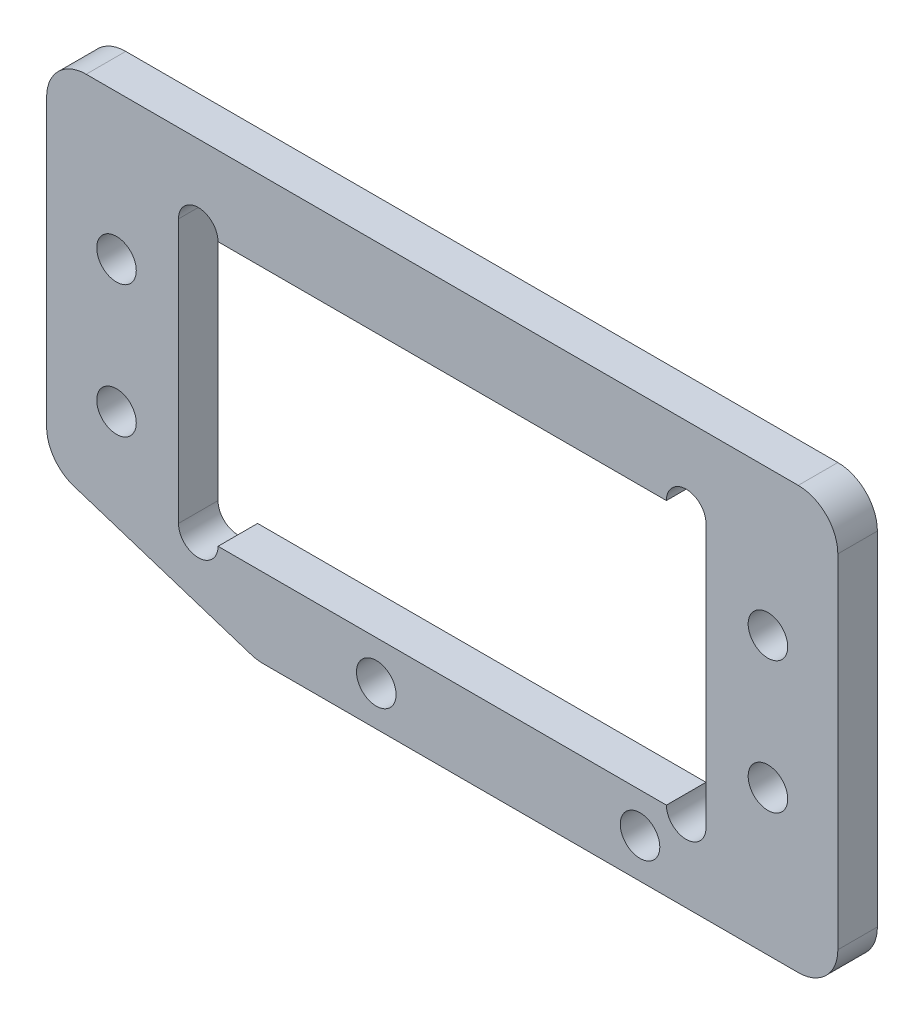
ISO-10303-21;
HEADER;
FILE_DESCRIPTION(('STEP AP214'),'2;1');
FILE_NAME('part.step','',(''),(''),'','','');
FILE_SCHEMA(('AUTOMOTIVE_DESIGN { 1 0 10303 214 1 1 1 1 }'));
ENDSEC;
DATA;
#1=APPLICATION_CONTEXT('core data for automotive mechanical design processes');
#2=APPLICATION_PROTOCOL_DEFINITION('international standard','automotive_design',2000,#1);
#3=PRODUCT_CONTEXT('',#1,'mechanical');
#4=PRODUCT('Part','Part','',(#3));
#5=PRODUCT_RELATED_PRODUCT_CATEGORY('part','',(#4));
#6=PRODUCT_DEFINITION_FORMATION('','',#4);
#7=PRODUCT_DEFINITION_CONTEXT('part definition',#1,'design');
#8=PRODUCT_DEFINITION('design','',#6,#7);
#9=PRODUCT_DEFINITION_SHAPE('','',#8);
#10=(LENGTH_UNIT() NAMED_UNIT(*) SI_UNIT(.MILLI.,.METRE.));
#11=(NAMED_UNIT(*) PLANE_ANGLE_UNIT() SI_UNIT($,.RADIAN.));
#12=(NAMED_UNIT(*) SI_UNIT($,.STERADIAN.) SOLID_ANGLE_UNIT());
#13=UNCERTAINTY_MEASURE_WITH_UNIT(LENGTH_MEASURE(1.E-05),#10,'distance_accuracy_value','');
#14=(GEOMETRIC_REPRESENTATION_CONTEXT(3) GLOBAL_UNCERTAINTY_ASSIGNED_CONTEXT((#13)) GLOBAL_UNIT_ASSIGNED_CONTEXT((#10,
#11,#12)) REPRESENTATION_CONTEXT('',''));
#15=CARTESIAN_POINT('',(0.,0.,0.));
#16=DIRECTION('',(0.,0.,1.));
#17=DIRECTION('',(1.,0.,0.));
#18=AXIS2_PLACEMENT_3D('',#15,#16,#17);
#19=CARTESIAN_POINT('',(0.,0.,3.));
#20=DIRECTION('',(0.,0.,1.));
#21=DIRECTION('',(1.,0.,0.));
#22=AXIS2_PLACEMENT_3D('',#19,#20,#21);
#23=PLANE('',#22);
#24=DIRECTION('',(0.,-1.,0.));
#25=VECTOR('',#24,1.);
#26=CARTESIAN_POINT('',(-10.,6.,3.));
#27=LINE('',#26,#25);
#28=CARTESIAN_POINT('',(-10.,3.,3.));
#29=VERTEX_POINT('',#28);
#30=CARTESIAN_POINT('',(-10.,-18.6692396681873,3.));
#31=VERTEX_POINT('',#30);
#32=EDGE_CURVE('E218',#29,#31,#27,.T.);
#33=ORIENTED_EDGE('',*,*,#32,.T.);
#34=CARTESIAN_POINT('',(-7.,-18.6692396681873,3.));
#35=DIRECTION('',(0.,0.,1.));
#36=DIRECTION('',(1.,0.,0.));
#37=AXIS2_PLACEMENT_3D('',#34,#35,#36);
#38=CIRCLE('',#37,3.);
#39=CARTESIAN_POINT('',(-7.9214460683982,-21.5242242816368,3.));
#40=VERTEX_POINT('',#39);
#41=EDGE_CURVE('E42',#31,#40,#38,.T.);
#42=ORIENTED_EDGE('',*,*,#41,.T.);
#43=DIRECTION('',(-0.951661537816506,0.307148689466068,0.));
#44=VECTOR('',#43,1.);
#45=CARTESIAN_POINT('',(-7.03887680716743,-21.8090734440523,3.));
#46=LINE('',#45,#44);
#47=CARTESIAN_POINT('',(5.4968694857136,-25.8549846134495,3.));
#48=VERTEX_POINT('',#47);
#49=EDGE_CURVE('E280',#48,#40,#46,.T.);
#50=ORIENTED_EDGE('',*,*,#49,.F.);
#51=CARTESIAN_POINT('',(6.4183155541118,-23.,3.));
#52=DIRECTION('',(0.,0.,1.));
#53=DIRECTION('',(1.,0.,0.));
#54=AXIS2_PLACEMENT_3D('',#51,#52,#53);
#55=CIRCLE('',#54,3.);
#56=CARTESIAN_POINT('',(6.4183155541118,-26.,3.));
#57=VERTEX_POINT('',#56);
#58=EDGE_CURVE('E49',#48,#57,#55,.T.);
#59=ORIENTED_EDGE('',*,*,#58,.T.);
#60=DIRECTION('',(1.,0.,0.));
#61=VECTOR('',#60,1.);
#62=CARTESIAN_POINT('',(-10.,-26.,3.));
#63=LINE('',#62,#61);
#64=CARTESIAN_POINT('',(47.,-26.,3.));
#65=VERTEX_POINT('',#64);
#66=EDGE_CURVE('E220',#57,#65,#63,.T.);
#67=ORIENTED_EDGE('',*,*,#66,.T.);
#68=CARTESIAN_POINT('',(47.,-23.,3.));
#69=DIRECTION('',(0.,0.,1.));
#70=DIRECTION('',(1.,0.,0.));
#71=AXIS2_PLACEMENT_3D('',#68,#69,#70);
#72=CIRCLE('',#71,3.);
#73=CARTESIAN_POINT('',(50.,-23.,3.));
#74=VERTEX_POINT('',#73);
#75=EDGE_CURVE('E258',#65,#74,#72,.T.);
#76=ORIENTED_EDGE('',*,*,#75,.T.);
#77=DIRECTION('',(0.,1.,0.));
#78=VECTOR('',#77,1.);
#79=CARTESIAN_POINT('',(50.,6.,3.));
#80=LINE('',#79,#78);
#81=CARTESIAN_POINT('',(50.,3.,3.));
#82=VERTEX_POINT('',#81);
#83=EDGE_CURVE('E223',#74,#82,#80,.T.);
#84=ORIENTED_EDGE('',*,*,#83,.T.);
#85=CARTESIAN_POINT('',(47.,3.,3.));
#86=DIRECTION('',(0.,0.,1.));
#87=DIRECTION('',(1.,0.,0.));
#88=AXIS2_PLACEMENT_3D('',#85,#86,#87);
#89=CIRCLE('',#88,3.);
#90=CARTESIAN_POINT('',(47.,6.,3.));
#91=VERTEX_POINT('',#90);
#92=EDGE_CURVE('E260',#82,#91,#89,.T.);
#93=ORIENTED_EDGE('',*,*,#92,.T.);
#94=DIRECTION('',(-1.,0.,0.));
#95=VECTOR('',#94,1.);
#96=CARTESIAN_POINT('',(-10.,6.,3.));
#97=LINE('',#96,#95);
#98=CARTESIAN_POINT('',(-7.,6.,3.));
#99=VERTEX_POINT('',#98);
#100=EDGE_CURVE('E173',#91,#99,#97,.T.);
#101=ORIENTED_EDGE('',*,*,#100,.T.);
#102=CARTESIAN_POINT('',(-7.,3.,3.));
#103=DIRECTION('',(0.,0.,1.));
#104=DIRECTION('',(1.,0.,0.));
#105=AXIS2_PLACEMENT_3D('',#102,#103,#104);
#106=CIRCLE('',#105,3.);
#107=EDGE_CURVE('E256',#99,#29,#106,.T.);
#108=ORIENTED_EDGE('',*,*,#107,.T.);
#109=EDGE_LOOP('',(#33,#42,#50,#59,#67,#76,#84,#93,#101,#108));
#110=FACE_BOUND('',#109,.T.);
#111=CARTESIAN_POINT('',(1.5,-20.,3.));
#112=DIRECTION('',(0.,0.,1.));
#113=DIRECTION('',(1.,0.,0.));
#114=AXIS2_PLACEMENT_3D('',#111,#112,#113);
#115=CIRCLE('',#114,1.5);
#116=CARTESIAN_POINT('',(0.,-20.,3.));
#117=VERTEX_POINT('',#116);
#118=CARTESIAN_POINT('',(3.,-20.,3.));
#119=VERTEX_POINT('',#118);
#120=EDGE_CURVE('E288',#117,#119,#115,.T.);
#121=ORIENTED_EDGE('',*,*,#120,.F.);
#122=DIRECTION('',(0.,-1.,0.));
#123=VECTOR('',#122,1.);
#124=CARTESIAN_POINT('',(0.,0.,3.));
#125=LINE('',#124,#123);
#126=CARTESIAN_POINT('',(0.,0.,3.));
#127=VERTEX_POINT('',#126);
#128=EDGE_CURVE('E183',#127,#117,#125,.T.);
#129=ORIENTED_EDGE('',*,*,#128,.F.);
#130=CARTESIAN_POINT('',(1.5,0.,3.));
#131=DIRECTION('',(0.,0.,1.));
#132=DIRECTION('',(1.,0.,0.));
#133=AXIS2_PLACEMENT_3D('',#130,#131,#132);
#134=CIRCLE('',#133,1.5);
#135=CARTESIAN_POINT('',(3.,0.,3.));
#136=VERTEX_POINT('',#135);
#137=EDGE_CURVE('E164',#136,#127,#134,.T.);
#138=ORIENTED_EDGE('',*,*,#137,.F.);
#139=DIRECTION('',(-1.,0.,0.));
#140=VECTOR('',#139,1.);
#141=CARTESIAN_POINT('',(0.,0.,3.));
#142=LINE('',#141,#140);
#143=CARTESIAN_POINT('',(37.,0.,3.));
#144=VERTEX_POINT('',#143);
#145=EDGE_CURVE('E181',#144,#136,#142,.T.);
#146=ORIENTED_EDGE('',*,*,#145,.F.);
#147=CARTESIAN_POINT('',(38.5,0.,3.));
#148=DIRECTION('',(0.,0.,1.));
#149=DIRECTION('',(1.,0.,0.));
#150=AXIS2_PLACEMENT_3D('',#147,#148,#149);
#151=CIRCLE('',#150,1.5);
#152=CARTESIAN_POINT('',(40.,0.,3.));
#153=VERTEX_POINT('',#152);
#154=EDGE_CURVE('E465',#153,#144,#151,.T.);
#155=ORIENTED_EDGE('',*,*,#154,.F.);
#156=DIRECTION('',(0.,1.,0.));
#157=VECTOR('',#156,1.);
#158=CARTESIAN_POINT('',(40.,0.,3.));
#159=LINE('',#158,#157);
#160=CARTESIAN_POINT('',(40.,-20.,3.));
#161=VERTEX_POINT('',#160);
#162=EDGE_CURVE('E189',#161,#153,#159,.T.);
#163=ORIENTED_EDGE('',*,*,#162,.F.);
#164=CARTESIAN_POINT('',(38.5,-20.,3.));
#165=DIRECTION('',(0.,0.,1.));
#166=DIRECTION('',(1.,0.,0.));
#167=AXIS2_PLACEMENT_3D('',#164,#165,#166);
#168=CIRCLE('',#167,1.5);
#169=CARTESIAN_POINT('',(37.,-20.,3.));
#170=VERTEX_POINT('',#169);
#171=EDGE_CURVE('E417',#170,#161,#168,.T.);
#172=ORIENTED_EDGE('',*,*,#171,.F.);
#173=DIRECTION('',(1.,0.,0.));
#174=VECTOR('',#173,1.);
#175=CARTESIAN_POINT('',(0.,-20.,3.));
#176=LINE('',#175,#174);
#177=EDGE_CURVE('E194',#119,#170,#176,.T.);
#178=ORIENTED_EDGE('',*,*,#177,.F.);
#179=EDGE_LOOP('',(#121,#129,#138,#146,#155,#163,#172,#178));
#180=FACE_BOUND('',#179,.T.);
#181=CARTESIAN_POINT('',(35.,-23.,3.));
#182=DIRECTION('',(0.,0.,1.));
#183=DIRECTION('',(1.,0.,0.));
#184=AXIS2_PLACEMENT_3D('',#181,#182,#183);
#185=CIRCLE('',#184,1.5);
#186=CARTESIAN_POINT('',(36.5,-23.,3.));
#187=VERTEX_POINT('',#186);
#188=EDGE_CURVE('E441',#187,#187,#185,.T.);
#189=ORIENTED_EDGE('',*,*,#188,.F.);
#190=EDGE_LOOP('',(#189));
#191=FACE_BOUND('',#190,.T.);
#192=CARTESIAN_POINT('',(44.7,-5.,3.));
#193=DIRECTION('',(0.,0.,1.));
#194=DIRECTION('',(1.,0.,0.));
#195=AXIS2_PLACEMENT_3D('',#192,#193,#194);
#196=CIRCLE('',#195,1.5);
#197=CARTESIAN_POINT('',(46.2,-5.,3.));
#198=VERTEX_POINT('',#197);
#199=EDGE_CURVE('E429',#198,#198,#196,.T.);
#200=ORIENTED_EDGE('',*,*,#199,.F.);
#201=EDGE_LOOP('',(#200));
#202=FACE_BOUND('',#201,.T.);
#203=CARTESIAN_POINT('',(-4.7,-5.,3.));
#204=DIRECTION('',(0.,0.,1.));
#205=DIRECTION('',(1.,0.,0.));
#206=AXIS2_PLACEMENT_3D('',#203,#204,#205);
#207=CIRCLE('',#206,1.5);
#208=CARTESIAN_POINT('',(-3.2,-5.,3.));
#209=VERTEX_POINT('',#208);
#210=EDGE_CURVE('E202',#209,#209,#207,.T.);
#211=ORIENTED_EDGE('',*,*,#210,.F.);
#212=EDGE_LOOP('',(#211));
#213=FACE_BOUND('',#212,.T.);
#214=CARTESIAN_POINT('',(-4.7,-15.,3.));
#215=DIRECTION('',(0.,0.,1.));
#216=DIRECTION('',(1.,0.,0.));
#217=AXIS2_PLACEMENT_3D('',#214,#215,#216);
#218=CIRCLE('',#217,1.5);
#219=CARTESIAN_POINT('',(-3.2,-15.,3.));
#220=VERTEX_POINT('',#219);
#221=EDGE_CURVE('E423',#220,#220,#218,.T.);
#222=ORIENTED_EDGE('',*,*,#221,.F.);
#223=EDGE_LOOP('',(#222));
#224=FACE_BOUND('',#223,.T.);
#225=CARTESIAN_POINT('',(44.7,-15.,3.));
#226=DIRECTION('',(0.,0.,1.));
#227=DIRECTION('',(1.,0.,0.));
#228=AXIS2_PLACEMENT_3D('',#225,#226,#227);
#229=CIRCLE('',#228,1.5);
#230=CARTESIAN_POINT('',(46.2,-15.,3.));
#231=VERTEX_POINT('',#230);
#232=EDGE_CURVE('E435',#231,#231,#229,.T.);
#233=ORIENTED_EDGE('',*,*,#232,.F.);
#234=EDGE_LOOP('',(#233));
#235=FACE_BOUND('',#234,.T.);
#236=CARTESIAN_POINT('',(15.,-23.,3.));
#237=DIRECTION('',(0.,0.,1.));
#238=DIRECTION('',(1.,0.,0.));
#239=AXIS2_PLACEMENT_3D('',#236,#237,#238);
#240=CIRCLE('',#239,1.5);
#241=CARTESIAN_POINT('',(16.5,-23.,3.));
#242=VERTEX_POINT('',#241);
#243=EDGE_CURVE('E447',#242,#242,#240,.T.);
#244=ORIENTED_EDGE('',*,*,#243,.F.);
#245=EDGE_LOOP('',(#244));
#246=FACE_BOUND('',#245,.T.);
#247=ADVANCED_FACE('F34',(#110,#180,#191,#202,#213,#224,#235,#246),#23,.T.);
#248=CARTESIAN_POINT('',(0.,0.,0.));
#249=DIRECTION('',(0.,0.,1.));
#250=DIRECTION('',(1.,0.,0.));
#251=AXIS2_PLACEMENT_3D('',#248,#249,#250);
#252=PLANE('',#251);
#253=DIRECTION('',(0.951661537816506,-0.307148689466068,0.));
#254=VECTOR('',#253,1.);
#255=CARTESIAN_POINT('',(5.94618140044645,-26.,0.));
#256=LINE('',#255,#254);
#257=CARTESIAN_POINT('',(-7.9214460683982,-21.5242242816368,0.));
#258=VERTEX_POINT('',#257);
#259=CARTESIAN_POINT('',(5.4968694857136,-25.8549846134495,0.));
#260=VERTEX_POINT('',#259);
#261=EDGE_CURVE('E289',#258,#260,#256,.T.);
#262=ORIENTED_EDGE('',*,*,#261,.F.);
#263=CARTESIAN_POINT('',(-7.,-18.6692396681873,0.));
#264=DIRECTION('',(0.,0.,1.));
#265=DIRECTION('',(1.,0.,0.));
#266=AXIS2_PLACEMENT_3D('',#263,#264,#265);
#267=CIRCLE('',#266,3.);
#268=CARTESIAN_POINT('',(-10.,-18.6692396681873,0.));
#269=VERTEX_POINT('',#268);
#270=EDGE_CURVE('E275',#258,#269,#267,.F.);
#271=ORIENTED_EDGE('',*,*,#270,.T.);
#272=DIRECTION('',(0.,-1.,0.));
#273=VECTOR('',#272,1.);
#274=CARTESIAN_POINT('',(-10.,6.,0.));
#275=LINE('',#274,#273);
#276=CARTESIAN_POINT('',(-10.,3.,0.));
#277=VERTEX_POINT('',#276);
#278=EDGE_CURVE('E217',#277,#269,#275,.T.);
#279=ORIENTED_EDGE('',*,*,#278,.F.);
#280=CARTESIAN_POINT('',(-7.,3.,0.));
#281=DIRECTION('',(0.,0.,1.));
#282=DIRECTION('',(1.,0.,0.));
#283=AXIS2_PLACEMENT_3D('',#280,#281,#282);
#284=CIRCLE('',#283,3.);
#285=CARTESIAN_POINT('',(-7.,6.,0.));
#286=VERTEX_POINT('',#285);
#287=EDGE_CURVE('E244',#277,#286,#284,.F.);
#288=ORIENTED_EDGE('',*,*,#287,.T.);
#289=DIRECTION('',(-1.,0.,0.));
#290=VECTOR('',#289,1.);
#291=CARTESIAN_POINT('',(-10.,6.,0.));
#292=LINE('',#291,#290);
#293=CARTESIAN_POINT('',(47.,6.,0.));
#294=VERTEX_POINT('',#293);
#295=EDGE_CURVE('E221',#294,#286,#292,.T.);
#296=ORIENTED_EDGE('',*,*,#295,.F.);
#297=CARTESIAN_POINT('',(47.,3.,0.));
#298=DIRECTION('',(0.,0.,1.));
#299=DIRECTION('',(1.,0.,0.));
#300=AXIS2_PLACEMENT_3D('',#297,#298,#299);
#301=CIRCLE('',#300,3.);
#302=CARTESIAN_POINT('',(50.,3.,0.));
#303=VERTEX_POINT('',#302);
#304=EDGE_CURVE('E249',#294,#303,#301,.F.);
#305=ORIENTED_EDGE('',*,*,#304,.T.);
#306=DIRECTION('',(0.,1.,0.));
#307=VECTOR('',#306,1.);
#308=CARTESIAN_POINT('',(50.,6.,0.));
#309=LINE('',#308,#307);
#310=CARTESIAN_POINT('',(50.,-23.,0.));
#311=VERTEX_POINT('',#310);
#312=EDGE_CURVE('E231',#311,#303,#309,.T.);
#313=ORIENTED_EDGE('',*,*,#312,.F.);
#314=CARTESIAN_POINT('',(47.,-23.,0.));
#315=DIRECTION('',(0.,0.,1.));
#316=DIRECTION('',(1.,0.,0.));
#317=AXIS2_PLACEMENT_3D('',#314,#315,#316);
#318=CIRCLE('',#317,3.);
#319=CARTESIAN_POINT('',(47.,-26.,0.));
#320=VERTEX_POINT('',#319);
#321=EDGE_CURVE('E246',#311,#320,#318,.F.);
#322=ORIENTED_EDGE('',*,*,#321,.T.);
#323=DIRECTION('',(1.,0.,0.));
#324=VECTOR('',#323,1.);
#325=CARTESIAN_POINT('',(-10.,-26.,0.));
#326=LINE('',#325,#324);
#327=CARTESIAN_POINT('',(6.4183155541118,-26.,0.));
#328=VERTEX_POINT('',#327);
#329=EDGE_CURVE('E229',#328,#320,#326,.T.);
#330=ORIENTED_EDGE('',*,*,#329,.F.);
#331=CARTESIAN_POINT('',(6.4183155541118,-23.,0.));
#332=DIRECTION('',(0.,0.,1.));
#333=DIRECTION('',(1.,0.,0.));
#334=AXIS2_PLACEMENT_3D('',#331,#332,#333);
#335=CIRCLE('',#334,3.);
#336=EDGE_CURVE('E273',#328,#260,#335,.F.);
#337=ORIENTED_EDGE('',*,*,#336,.T.);
#338=EDGE_LOOP('',(#262,#271,#279,#288,#296,#305,#313,#322,#330,#337));
#339=FACE_BOUND('',#338,.T.);
#340=DIRECTION('',(0.,-1.,0.));
#341=VECTOR('',#340,1.);
#342=CARTESIAN_POINT('',(0.,0.,0.));
#343=LINE('',#342,#341);
#344=CARTESIAN_POINT('',(0.,0.,0.));
#345=VERTEX_POINT('',#344);
#346=CARTESIAN_POINT('',(0.,-20.,0.));
#347=VERTEX_POINT('',#346);
#348=EDGE_CURVE('E198',#345,#347,#343,.T.);
#349=ORIENTED_EDGE('',*,*,#348,.T.);
#350=CARTESIAN_POINT('',(1.5,-20.,0.));
#351=DIRECTION('',(0.,0.,1.));
#352=DIRECTION('',(1.,0.,0.));
#353=AXIS2_PLACEMENT_3D('',#350,#351,#352);
#354=CIRCLE('',#353,1.5);
#355=CARTESIAN_POINT('',(3.,-20.,0.));
#356=VERTEX_POINT('',#355);
#357=EDGE_CURVE('E459',#347,#356,#354,.T.);
#358=ORIENTED_EDGE('',*,*,#357,.T.);
#359=DIRECTION('',(1.,0.,0.));
#360=VECTOR('',#359,1.);
#361=CARTESIAN_POINT('',(0.,-20.,0.));
#362=LINE('',#361,#360);
#363=CARTESIAN_POINT('',(37.,-20.,0.));
#364=VERTEX_POINT('',#363);
#365=EDGE_CURVE('E201',#356,#364,#362,.T.);
#366=ORIENTED_EDGE('',*,*,#365,.T.);
#367=CARTESIAN_POINT('',(38.5,-20.,0.));
#368=DIRECTION('',(0.,0.,1.));
#369=DIRECTION('',(1.,0.,0.));
#370=AXIS2_PLACEMENT_3D('',#367,#368,#369);
#371=CIRCLE('',#370,1.5);
#372=CARTESIAN_POINT('',(40.,-20.,0.));
#373=VERTEX_POINT('',#372);
#374=EDGE_CURVE('E462',#364,#373,#371,.T.);
#375=ORIENTED_EDGE('',*,*,#374,.T.);
#376=DIRECTION('',(0.,1.,0.));
#377=VECTOR('',#376,1.);
#378=CARTESIAN_POINT('',(40.,0.,0.));
#379=LINE('',#378,#377);
#380=CARTESIAN_POINT('',(40.,0.,0.));
#381=VERTEX_POINT('',#380);
#382=EDGE_CURVE('E205',#373,#381,#379,.T.);
#383=ORIENTED_EDGE('',*,*,#382,.T.);
#384=CARTESIAN_POINT('',(38.5,0.,0.));
#385=DIRECTION('',(0.,0.,1.));
#386=DIRECTION('',(1.,0.,0.));
#387=AXIS2_PLACEMENT_3D('',#384,#385,#386);
#388=CIRCLE('',#387,1.5);
#389=CARTESIAN_POINT('',(37.,0.,0.));
#390=VERTEX_POINT('',#389);
#391=EDGE_CURVE('E184',#381,#390,#388,.T.);
#392=ORIENTED_EDGE('',*,*,#391,.T.);
#393=DIRECTION('',(-1.,0.,0.));
#394=VECTOR('',#393,1.);
#395=CARTESIAN_POINT('',(0.,0.,0.));
#396=LINE('',#395,#394);
#397=CARTESIAN_POINT('',(3.,0.,0.));
#398=VERTEX_POINT('',#397);
#399=EDGE_CURVE('E208',#390,#398,#396,.T.);
#400=ORIENTED_EDGE('',*,*,#399,.T.);
#401=CARTESIAN_POINT('',(1.5,0.,0.));
#402=DIRECTION('',(0.,0.,1.));
#403=DIRECTION('',(1.,0.,0.));
#404=AXIS2_PLACEMENT_3D('',#401,#402,#403);
#405=CIRCLE('',#404,1.5);
#406=EDGE_CURVE('E167',#398,#345,#405,.T.);
#407=ORIENTED_EDGE('',*,*,#406,.T.);
#408=EDGE_LOOP('',(#349,#358,#366,#375,#383,#392,#400,#407));
#409=FACE_BOUND('',#408,.T.);
#410=CARTESIAN_POINT('',(-4.7,-5.,0.));
#411=DIRECTION('',(0.,0.,1.));
#412=DIRECTION('',(1.,0.,0.));
#413=AXIS2_PLACEMENT_3D('',#410,#411,#412);
#414=CIRCLE('',#413,1.5);
#415=CARTESIAN_POINT('',(-3.2,-5.,0.));
#416=VERTEX_POINT('',#415);
#417=EDGE_CURVE('E420',#416,#416,#414,.T.);
#418=ORIENTED_EDGE('',*,*,#417,.T.);
#419=EDGE_LOOP('',(#418));
#420=FACE_BOUND('',#419,.T.);
#421=CARTESIAN_POINT('',(-4.7,-15.,0.));
#422=DIRECTION('',(0.,0.,1.));
#423=DIRECTION('',(1.,0.,0.));
#424=AXIS2_PLACEMENT_3D('',#421,#422,#423);
#425=CIRCLE('',#424,1.5);
#426=CARTESIAN_POINT('',(-3.2,-15.,0.));
#427=VERTEX_POINT('',#426);
#428=EDGE_CURVE('E426',#427,#427,#425,.T.);
#429=ORIENTED_EDGE('',*,*,#428,.T.);
#430=EDGE_LOOP('',(#429));
#431=FACE_BOUND('',#430,.T.);
#432=CARTESIAN_POINT('',(44.7,-5.,0.));
#433=DIRECTION('',(0.,0.,1.));
#434=DIRECTION('',(1.,0.,0.));
#435=AXIS2_PLACEMENT_3D('',#432,#433,#434);
#436=CIRCLE('',#435,1.5);
#437=CARTESIAN_POINT('',(46.2,-5.,0.));
#438=VERTEX_POINT('',#437);
#439=EDGE_CURVE('E432',#438,#438,#436,.T.);
#440=ORIENTED_EDGE('',*,*,#439,.T.);
#441=EDGE_LOOP('',(#440));
#442=FACE_BOUND('',#441,.T.);
#443=CARTESIAN_POINT('',(44.7,-15.,0.));
#444=DIRECTION('',(0.,0.,1.));
#445=DIRECTION('',(1.,0.,0.));
#446=AXIS2_PLACEMENT_3D('',#443,#444,#445);
#447=CIRCLE('',#446,1.5);
#448=CARTESIAN_POINT('',(46.2,-15.,0.));
#449=VERTEX_POINT('',#448);
#450=EDGE_CURVE('E438',#449,#449,#447,.T.);
#451=ORIENTED_EDGE('',*,*,#450,.T.);
#452=EDGE_LOOP('',(#451));
#453=FACE_BOUND('',#452,.T.);
#454=CARTESIAN_POINT('',(35.,-23.,0.));
#455=DIRECTION('',(0.,0.,1.));
#456=DIRECTION('',(1.,0.,0.));
#457=AXIS2_PLACEMENT_3D('',#454,#455,#456);
#458=CIRCLE('',#457,1.5);
#459=CARTESIAN_POINT('',(36.5,-23.,0.));
#460=VERTEX_POINT('',#459);
#461=EDGE_CURVE('E444',#460,#460,#458,.T.);
#462=ORIENTED_EDGE('',*,*,#461,.T.);
#463=EDGE_LOOP('',(#462));
#464=FACE_BOUND('',#463,.T.);
#465=CARTESIAN_POINT('',(15.,-23.,0.));
#466=DIRECTION('',(0.,0.,1.));
#467=DIRECTION('',(1.,0.,0.));
#468=AXIS2_PLACEMENT_3D('',#465,#466,#467);
#469=CIRCLE('',#468,1.5);
#470=CARTESIAN_POINT('',(16.5,-23.,0.));
#471=VERTEX_POINT('',#470);
#472=EDGE_CURVE('E450',#471,#471,#469,.T.);
#473=ORIENTED_EDGE('',*,*,#472,.T.);
#474=EDGE_LOOP('',(#473));
#475=FACE_BOUND('',#474,.T.);
#476=ADVANCED_FACE('F294',(#339,#409,#420,#431,#442,#453,#464,#475),#252,.F.);
#477=CARTESIAN_POINT('',(-10.,6.,3.));
#478=DIRECTION('',(1.,0.,0.));
#479=DIRECTION('',(0.,1.,0.));
#480=AXIS2_PLACEMENT_3D('',#477,#478,#479);
#481=PLANE('',#480);
#482=ORIENTED_EDGE('',*,*,#278,.T.);
#483=DIRECTION('',(0.,0.,-1.));
#484=VECTOR('',#483,1.);
#485=CARTESIAN_POINT('',(-10.,-18.6692396681873,3.));
#486=LINE('',#485,#484);
#487=EDGE_CURVE('E57',#269,#31,#486,.F.);
#488=ORIENTED_EDGE('',*,*,#487,.T.);
#489=ORIENTED_EDGE('',*,*,#32,.F.);
#490=DIRECTION('',(0.,0.,-1.));
#491=VECTOR('',#490,1.);
#492=CARTESIAN_POINT('',(-10.,3.,3.));
#493=LINE('',#492,#491);
#494=EDGE_CURVE('E265',#29,#277,#493,.T.);
#495=ORIENTED_EDGE('',*,*,#494,.T.);
#496=EDGE_LOOP('',(#482,#488,#489,#495));
#497=FACE_BOUND('',#496,.T.);
#498=ADVANCED_FACE('F296',(#497),#481,.F.);
#499=CARTESIAN_POINT('',(-10.,-26.,3.));
#500=DIRECTION('',(0.,1.,0.));
#501=DIRECTION('',(0.,0.,1.));
#502=AXIS2_PLACEMENT_3D('',#499,#500,#501);
#503=PLANE('',#502);
#504=ORIENTED_EDGE('',*,*,#66,.F.);
#505=DIRECTION('',(0.,0.,-1.));
#506=VECTOR('',#505,1.);
#507=CARTESIAN_POINT('',(6.4183155541118,-26.,3.));
#508=LINE('',#507,#506);
#509=EDGE_CURVE('E11',#57,#328,#508,.T.);
#510=ORIENTED_EDGE('',*,*,#509,.T.);
#511=ORIENTED_EDGE('',*,*,#329,.T.);
#512=DIRECTION('',(0.,0.,-1.));
#513=VECTOR('',#512,1.);
#514=CARTESIAN_POINT('',(47.,-26.,3.));
#515=LINE('',#514,#513);
#516=EDGE_CURVE('E262',#320,#65,#515,.F.);
#517=ORIENTED_EDGE('',*,*,#516,.T.);
#518=EDGE_LOOP('',(#504,#510,#511,#517));
#519=FACE_BOUND('',#518,.T.);
#520=ADVANCED_FACE('F322',(#519),#503,.F.);
#521=CARTESIAN_POINT('',(50.,6.,3.));
#522=DIRECTION('',(-1.,0.,0.));
#523=DIRECTION('',(0.,-1.,0.));
#524=AXIS2_PLACEMENT_3D('',#521,#522,#523);
#525=PLANE('',#524);
#526=ORIENTED_EDGE('',*,*,#312,.T.);
#527=DIRECTION('',(0.,0.,-1.));
#528=VECTOR('',#527,1.);
#529=CARTESIAN_POINT('',(50.,3.,3.));
#530=LINE('',#529,#528);
#531=EDGE_CURVE('E254',#303,#82,#530,.F.);
#532=ORIENTED_EDGE('',*,*,#531,.T.);
#533=ORIENTED_EDGE('',*,*,#83,.F.);
#534=DIRECTION('',(0.,0.,-1.));
#535=VECTOR('',#534,1.);
#536=CARTESIAN_POINT('',(50.,-23.,3.));
#537=LINE('',#536,#535);
#538=EDGE_CURVE('E251',#74,#311,#537,.T.);
#539=ORIENTED_EDGE('',*,*,#538,.T.);
#540=EDGE_LOOP('',(#526,#532,#533,#539));
#541=FACE_BOUND('',#540,.T.);
#542=ADVANCED_FACE('F313',(#541),#525,.F.);
#543=CARTESIAN_POINT('',(-10.,6.,3.));
#544=DIRECTION('',(0.,-1.,0.));
#545=DIRECTION('',(0.,0.,-1.));
#546=AXIS2_PLACEMENT_3D('',#543,#544,#545);
#547=PLANE('',#546);
#548=ORIENTED_EDGE('',*,*,#100,.F.);
#549=DIRECTION('',(0.,0.,-1.));
#550=VECTOR('',#549,1.);
#551=CARTESIAN_POINT('',(47.,6.,3.));
#552=LINE('',#551,#550);
#553=EDGE_CURVE('E241',#91,#294,#552,.T.);
#554=ORIENTED_EDGE('',*,*,#553,.T.);
#555=ORIENTED_EDGE('',*,*,#295,.T.);
#556=DIRECTION('',(0.,0.,-1.));
#557=VECTOR('',#556,1.);
#558=CARTESIAN_POINT('',(-7.,6.,3.));
#559=LINE('',#558,#557);
#560=EDGE_CURVE('E239',#286,#99,#559,.F.);
#561=ORIENTED_EDGE('',*,*,#560,.T.);
#562=EDGE_LOOP('',(#548,#554,#555,#561));
#563=FACE_BOUND('',#562,.T.);
#564=ADVANCED_FACE('F305',(#563),#547,.F.);
#565=CARTESIAN_POINT('',(0.,0.,3.));
#566=DIRECTION('',(1.,0.,0.));
#567=DIRECTION('',(0.,1.,0.));
#568=AXIS2_PLACEMENT_3D('',#565,#566,#567);
#569=PLANE('',#568);
#570=ORIENTED_EDGE('',*,*,#348,.F.);
#571=DIRECTION('',(0.,0.,-1.));
#572=VECTOR('',#571,1.);
#573=CARTESIAN_POINT('',(0.,0.,3.));
#574=LINE('',#573,#572);
#575=EDGE_CURVE('E188',#127,#345,#574,.T.);
#576=ORIENTED_EDGE('',*,*,#575,.F.);
#577=ORIENTED_EDGE('',*,*,#128,.T.);
#578=DIRECTION('',(0.,0.,-1.));
#579=VECTOR('',#578,1.);
#580=CARTESIAN_POINT('',(0.,-20.,3.));
#581=LINE('',#580,#579);
#582=EDGE_CURVE('E214',#117,#347,#581,.T.);
#583=ORIENTED_EDGE('',*,*,#582,.T.);
#584=EDGE_LOOP('',(#570,#576,#577,#583));
#585=FACE_BOUND('',#584,.T.);
#586=ADVANCED_FACE('F336',(#585),#569,.T.);
#587=CARTESIAN_POINT('',(0.,-20.,3.));
#588=DIRECTION('',(0.,1.,0.));
#589=DIRECTION('',(0.,0.,1.));
#590=AXIS2_PLACEMENT_3D('',#587,#588,#589);
#591=PLANE('',#590);
#592=DIRECTION('',(0.,0.,1.));
#593=VECTOR('',#592,1.);
#594=CARTESIAN_POINT('',(3.,-20.,0.));
#595=LINE('',#594,#593);
#596=EDGE_CURVE('E237',#119,#356,#595,.F.);
#597=ORIENTED_EDGE('',*,*,#596,.F.);
#598=ORIENTED_EDGE('',*,*,#177,.T.);
#599=DIRECTION('',(0.,0.,1.));
#600=VECTOR('',#599,1.);
#601=CARTESIAN_POINT('',(37.,-20.,0.));
#602=LINE('',#601,#600);
#603=EDGE_CURVE('E453',#364,#170,#602,.T.);
#604=ORIENTED_EDGE('',*,*,#603,.F.);
#605=ORIENTED_EDGE('',*,*,#365,.F.);
#606=EDGE_LOOP('',(#597,#598,#604,#605));
#607=FACE_BOUND('',#606,.T.);
#608=ADVANCED_FACE('F401',(#607),#591,.T.);
#609=CARTESIAN_POINT('',(40.,0.,3.));
#610=DIRECTION('',(-1.,0.,0.));
#611=DIRECTION('',(0.,0.,1.));
#612=AXIS2_PLACEMENT_3D('',#609,#610,#611);
#613=PLANE('',#612);
#614=ORIENTED_EDGE('',*,*,#382,.F.);
#615=DIRECTION('',(0.,0.,-1.));
#616=VECTOR('',#615,1.);
#617=CARTESIAN_POINT('',(40.,-20.,3.));
#618=LINE('',#617,#616);
#619=EDGE_CURVE('E212',#161,#373,#618,.T.);
#620=ORIENTED_EDGE('',*,*,#619,.F.);
#621=ORIENTED_EDGE('',*,*,#162,.T.);
#622=DIRECTION('',(0.,0.,-1.));
#623=VECTOR('',#622,1.);
#624=CARTESIAN_POINT('',(40.,0.,3.));
#625=LINE('',#624,#623);
#626=EDGE_CURVE('E191',#153,#381,#625,.T.);
#627=ORIENTED_EDGE('',*,*,#626,.T.);
#628=EDGE_LOOP('',(#614,#620,#621,#627));
#629=FACE_BOUND('',#628,.T.);
#630=ADVANCED_FACE('F399',(#629),#613,.T.);
#631=CARTESIAN_POINT('',(0.,0.,3.));
#632=DIRECTION('',(0.,-1.,0.));
#633=DIRECTION('',(0.,0.,-1.));
#634=AXIS2_PLACEMENT_3D('',#631,#632,#633);
#635=PLANE('',#634);
#636=DIRECTION('',(0.,0.,1.));
#637=VECTOR('',#636,1.);
#638=CARTESIAN_POINT('',(37.,0.,0.));
#639=LINE('',#638,#637);
#640=EDGE_CURVE('E172',#144,#390,#639,.F.);
#641=ORIENTED_EDGE('',*,*,#640,.F.);
#642=ORIENTED_EDGE('',*,*,#145,.T.);
#643=DIRECTION('',(0.,0.,1.));
#644=VECTOR('',#643,1.);
#645=CARTESIAN_POINT('',(3.,0.,0.));
#646=LINE('',#645,#644);
#647=EDGE_CURVE('E161',#398,#136,#646,.T.);
#648=ORIENTED_EDGE('',*,*,#647,.F.);
#649=ORIENTED_EDGE('',*,*,#399,.F.);
#650=EDGE_LOOP('',(#641,#642,#648,#649));
#651=FACE_BOUND('',#650,.T.);
#652=ADVANCED_FACE('F187',(#651),#635,.T.);
#653=CARTESIAN_POINT('',(-4.7,-5.,3.));
#654=DIRECTION('',(0.,0.,-1.));
#655=DIRECTION('',(-1.,0.,0.));
#656=AXIS2_PLACEMENT_3D('',#653,#654,#655);
#657=CYLINDRICAL_SURFACE('',#656,1.5);
#658=ORIENTED_EDGE('',*,*,#210,.T.);
#659=EDGE_LOOP('',(#658));
#660=FACE_BOUND('',#659,.T.);
#661=ORIENTED_EDGE('',*,*,#417,.F.);
#662=EDGE_LOOP('',(#661));
#663=FACE_BOUND('',#662,.T.);
#664=ADVANCED_FACE('F392',(#660,#663),#657,.F.);
#665=CARTESIAN_POINT('',(-4.7,-15.,3.));
#666=DIRECTION('',(0.,0.,-1.));
#667=DIRECTION('',(-1.,0.,0.));
#668=AXIS2_PLACEMENT_3D('',#665,#666,#667);
#669=CYLINDRICAL_SURFACE('',#668,1.5);
#670=ORIENTED_EDGE('',*,*,#221,.T.);
#671=EDGE_LOOP('',(#670));
#672=FACE_BOUND('',#671,.T.);
#673=ORIENTED_EDGE('',*,*,#428,.F.);
#674=EDGE_LOOP('',(#673));
#675=FACE_BOUND('',#674,.T.);
#676=ADVANCED_FACE('F388',(#672,#675),#669,.F.);
#677=CARTESIAN_POINT('',(44.7,-5.,3.));
#678=DIRECTION('',(0.,0.,-1.));
#679=DIRECTION('',(-1.,0.,0.));
#680=AXIS2_PLACEMENT_3D('',#677,#678,#679);
#681=CYLINDRICAL_SURFACE('',#680,1.5);
#682=ORIENTED_EDGE('',*,*,#199,.T.);
#683=EDGE_LOOP('',(#682));
#684=FACE_BOUND('',#683,.T.);
#685=ORIENTED_EDGE('',*,*,#439,.F.);
#686=EDGE_LOOP('',(#685));
#687=FACE_BOUND('',#686,.T.);
#688=ADVANCED_FACE('F384',(#684,#687),#681,.F.);
#689=CARTESIAN_POINT('',(44.7,-15.,3.));
#690=DIRECTION('',(0.,0.,-1.));
#691=DIRECTION('',(-1.,0.,0.));
#692=AXIS2_PLACEMENT_3D('',#689,#690,#691);
#693=CYLINDRICAL_SURFACE('',#692,1.5);
#694=ORIENTED_EDGE('',*,*,#232,.T.);
#695=EDGE_LOOP('',(#694));
#696=FACE_BOUND('',#695,.T.);
#697=ORIENTED_EDGE('',*,*,#450,.F.);
#698=EDGE_LOOP('',(#697));
#699=FACE_BOUND('',#698,.T.);
#700=ADVANCED_FACE('F380',(#696,#699),#693,.F.);
#701=CARTESIAN_POINT('',(35.,-23.,3.));
#702=DIRECTION('',(0.,0.,-1.));
#703=DIRECTION('',(-1.,0.,0.));
#704=AXIS2_PLACEMENT_3D('',#701,#702,#703);
#705=CYLINDRICAL_SURFACE('',#704,1.5);
#706=ORIENTED_EDGE('',*,*,#188,.T.);
#707=EDGE_LOOP('',(#706));
#708=FACE_BOUND('',#707,.T.);
#709=ORIENTED_EDGE('',*,*,#461,.F.);
#710=EDGE_LOOP('',(#709));
#711=FACE_BOUND('',#710,.T.);
#712=ADVANCED_FACE('F376',(#708,#711),#705,.F.);
#713=CARTESIAN_POINT('',(15.,-23.,3.));
#714=DIRECTION('',(0.,0.,-1.));
#715=DIRECTION('',(-1.,0.,0.));
#716=AXIS2_PLACEMENT_3D('',#713,#714,#715);
#717=CYLINDRICAL_SURFACE('',#716,1.5);
#718=ORIENTED_EDGE('',*,*,#243,.T.);
#719=EDGE_LOOP('',(#718));
#720=FACE_BOUND('',#719,.T.);
#721=ORIENTED_EDGE('',*,*,#472,.F.);
#722=EDGE_LOOP('',(#721));
#723=FACE_BOUND('',#722,.T.);
#724=ADVANCED_FACE('F373',(#720,#723),#717,.F.);
#725=CARTESIAN_POINT('',(1.5,0.,0.));
#726=DIRECTION('',(0.,0.,1.));
#727=DIRECTION('',(1.,0.,0.));
#728=AXIS2_PLACEMENT_3D('',#725,#726,#727);
#729=CYLINDRICAL_SURFACE('',#728,1.5);
#730=ORIENTED_EDGE('',*,*,#647,.T.);
#731=ORIENTED_EDGE('',*,*,#137,.T.);
#732=ORIENTED_EDGE('',*,*,#575,.T.);
#733=ORIENTED_EDGE('',*,*,#406,.F.);
#734=EDGE_LOOP('',(#730,#731,#732,#733));
#735=FACE_BOUND('',#734,.T.);
#736=ADVANCED_FACE('F163',(#735),#729,.F.);
#737=CARTESIAN_POINT('',(38.5,0.,0.));
#738=DIRECTION('',(0.,0.,1.));
#739=DIRECTION('',(1.,0.,0.));
#740=AXIS2_PLACEMENT_3D('',#737,#738,#739);
#741=CYLINDRICAL_SURFACE('',#740,1.5);
#742=ORIENTED_EDGE('',*,*,#626,.F.);
#743=ORIENTED_EDGE('',*,*,#154,.T.);
#744=ORIENTED_EDGE('',*,*,#640,.T.);
#745=ORIENTED_EDGE('',*,*,#391,.F.);
#746=EDGE_LOOP('',(#742,#743,#744,#745));
#747=FACE_BOUND('',#746,.T.);
#748=ADVANCED_FACE('F360',(#747),#741,.F.);
#749=CARTESIAN_POINT('',(38.5,-20.,0.));
#750=DIRECTION('',(0.,0.,1.));
#751=DIRECTION('',(1.,0.,0.));
#752=AXIS2_PLACEMENT_3D('',#749,#750,#751);
#753=CYLINDRICAL_SURFACE('',#752,1.5);
#754=ORIENTED_EDGE('',*,*,#603,.T.);
#755=ORIENTED_EDGE('',*,*,#171,.T.);
#756=ORIENTED_EDGE('',*,*,#619,.T.);
#757=ORIENTED_EDGE('',*,*,#374,.F.);
#758=EDGE_LOOP('',(#754,#755,#756,#757));
#759=FACE_BOUND('',#758,.T.);
#760=ADVANCED_FACE('F363',(#759),#753,.F.);
#761=CARTESIAN_POINT('',(1.5,-20.,0.));
#762=DIRECTION('',(0.,0.,1.));
#763=DIRECTION('',(1.,0.,0.));
#764=AXIS2_PLACEMENT_3D('',#761,#762,#763);
#765=CYLINDRICAL_SURFACE('',#764,1.5);
#766=ORIENTED_EDGE('',*,*,#582,.F.);
#767=ORIENTED_EDGE('',*,*,#120,.T.);
#768=ORIENTED_EDGE('',*,*,#596,.T.);
#769=ORIENTED_EDGE('',*,*,#357,.F.);
#770=EDGE_LOOP('',(#766,#767,#768,#769));
#771=FACE_BOUND('',#770,.T.);
#772=ADVANCED_FACE('F349',(#771),#765,.F.);
#773=CARTESIAN_POINT('',(47.,3.,3.));
#774=DIRECTION('',(0.,0.,-1.));
#775=DIRECTION('',(-1.,0.,0.));
#776=AXIS2_PLACEMENT_3D('',#773,#774,#775);
#777=CYLINDRICAL_SURFACE('',#776,3.);
#778=ORIENTED_EDGE('',*,*,#92,.F.);
#779=ORIENTED_EDGE('',*,*,#531,.F.);
#780=ORIENTED_EDGE('',*,*,#304,.F.);
#781=ORIENTED_EDGE('',*,*,#553,.F.);
#782=EDGE_LOOP('',(#778,#779,#780,#781));
#783=FACE_BOUND('',#782,.T.);
#784=ADVANCED_FACE('F309',(#783),#777,.T.);
#785=CARTESIAN_POINT('',(47.,-23.,3.));
#786=DIRECTION('',(0.,0.,-1.));
#787=DIRECTION('',(-1.,0.,0.));
#788=AXIS2_PLACEMENT_3D('',#785,#786,#787);
#789=CYLINDRICAL_SURFACE('',#788,3.);
#790=ORIENTED_EDGE('',*,*,#75,.F.);
#791=ORIENTED_EDGE('',*,*,#516,.F.);
#792=ORIENTED_EDGE('',*,*,#321,.F.);
#793=ORIENTED_EDGE('',*,*,#538,.F.);
#794=EDGE_LOOP('',(#790,#791,#792,#793));
#795=FACE_BOUND('',#794,.T.);
#796=ADVANCED_FACE('F318',(#795),#789,.T.);
#797=CARTESIAN_POINT('',(-7.,3.,3.));
#798=DIRECTION('',(0.,0.,-1.));
#799=DIRECTION('',(-1.,0.,0.));
#800=AXIS2_PLACEMENT_3D('',#797,#798,#799);
#801=CYLINDRICAL_SURFACE('',#800,3.);
#802=ORIENTED_EDGE('',*,*,#107,.F.);
#803=ORIENTED_EDGE('',*,*,#560,.F.);
#804=ORIENTED_EDGE('',*,*,#287,.F.);
#805=ORIENTED_EDGE('',*,*,#494,.F.);
#806=EDGE_LOOP('',(#802,#803,#804,#805));
#807=FACE_BOUND('',#806,.T.);
#808=ADVANCED_FACE('F300',(#807),#801,.T.);
#809=CARTESIAN_POINT('',(5.94618140044645,-26.,10.));
#810=DIRECTION('',(0.307148689466068,0.951661537816506,0.));
#811=DIRECTION('',(-0.951661537816506,0.307148689466068,0.));
#812=AXIS2_PLACEMENT_3D('',#809,#810,#811);
#813=PLANE('',#812);
#814=ORIENTED_EDGE('',*,*,#49,.T.);
#815=DIRECTION('',(0.,0.,-1.));
#816=VECTOR('',#815,1.);
#817=CARTESIAN_POINT('',(-7.9214460683982,-21.5242242816368,10.));
#818=LINE('',#817,#816);
#819=EDGE_CURVE('E270',#40,#258,#818,.T.);
#820=ORIENTED_EDGE('',*,*,#819,.T.);
#821=ORIENTED_EDGE('',*,*,#261,.T.);
#822=DIRECTION('',(0.,0.,-1.));
#823=VECTOR('',#822,1.);
#824=CARTESIAN_POINT('',(5.4968694857136,-25.8549846134495,10.));
#825=LINE('',#824,#823);
#826=EDGE_CURVE('E268',#260,#48,#825,.F.);
#827=ORIENTED_EDGE('',*,*,#826,.T.);
#828=EDGE_LOOP('',(#814,#820,#821,#827));
#829=FACE_BOUND('',#828,.T.);
#830=ADVANCED_FACE('F284',(#829),#813,.F.);
#831=CARTESIAN_POINT('',(-7.,-18.6692396681873,10.));
#832=DIRECTION('',(0.,0.,-1.));
#833=DIRECTION('',(-1.,0.,0.));
#834=AXIS2_PLACEMENT_3D('',#831,#832,#833);
#835=CYLINDRICAL_SURFACE('',#834,3.);
#836=ORIENTED_EDGE('',*,*,#41,.F.);
#837=ORIENTED_EDGE('',*,*,#487,.F.);
#838=ORIENTED_EDGE('',*,*,#270,.F.);
#839=ORIENTED_EDGE('',*,*,#819,.F.);
#840=EDGE_LOOP('',(#836,#837,#838,#839));
#841=FACE_BOUND('',#840,.T.);
#842=ADVANCED_FACE('F291',(#841),#835,.T.);
#843=CARTESIAN_POINT('',(6.4183155541118,-23.,3.));
#844=DIRECTION('',(0.,0.,-1.));
#845=DIRECTION('',(-1.,0.,0.));
#846=AXIS2_PLACEMENT_3D('',#843,#844,#845);
#847=CYLINDRICAL_SURFACE('',#846,3.);
#848=ORIENTED_EDGE('',*,*,#58,.F.);
#849=ORIENTED_EDGE('',*,*,#826,.F.);
#850=ORIENTED_EDGE('',*,*,#336,.F.);
#851=ORIENTED_EDGE('',*,*,#509,.F.);
#852=EDGE_LOOP('',(#848,#849,#850,#851));
#853=FACE_BOUND('',#852,.T.);
#854=ADVANCED_FACE('F36',(#853),#847,.T.);
#855=CLOSED_SHELL('',(#247,#476,#498,#520,#542,#564,#586,#608,#630,#652,#664,#676,#688,#700,
#712,#724,#736,#748,#760,#772,#784,#796,#808,#830,#842,#854));
#856=MANIFOLD_SOLID_BREP('B2',#855);
#857=ADVANCED_BREP_SHAPE_REPRESENTATION('',(#18,#856),#14);
#858=SHAPE_DEFINITION_REPRESENTATION(#9,#857);
ENDSEC;
END-ISO-10303-21;
